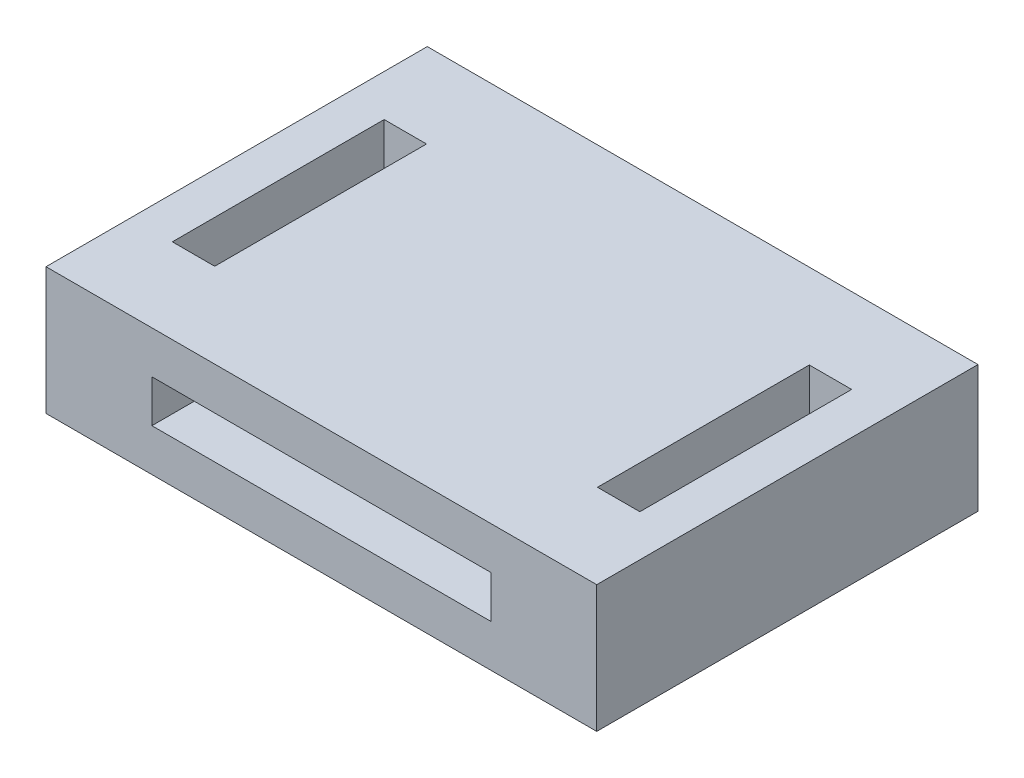
ISO-10303-21;
HEADER;
FILE_DESCRIPTION(('STEP AP214'),'2;1');
FILE_NAME('part.step','',(''),(''),'','','');
FILE_SCHEMA(('AUTOMOTIVE_DESIGN { 1 0 10303 214 1 1 1 1 }'));
ENDSEC;
DATA;
#1=APPLICATION_CONTEXT('core data for automotive mechanical design processes');
#2=APPLICATION_PROTOCOL_DEFINITION('international standard','automotive_design',2000,#1);
#3=PRODUCT_CONTEXT('',#1,'mechanical');
#4=PRODUCT('Part','Part','',(#3));
#5=PRODUCT_RELATED_PRODUCT_CATEGORY('part','',(#4));
#6=PRODUCT_DEFINITION_FORMATION('','',#4);
#7=PRODUCT_DEFINITION_CONTEXT('part definition',#1,'design');
#8=PRODUCT_DEFINITION('design','',#6,#7);
#9=PRODUCT_DEFINITION_SHAPE('','',#8);
#10=(LENGTH_UNIT() NAMED_UNIT(*) SI_UNIT(.MILLI.,.METRE.));
#11=(NAMED_UNIT(*) PLANE_ANGLE_UNIT() SI_UNIT($,.RADIAN.));
#12=(NAMED_UNIT(*) SI_UNIT($,.STERADIAN.) SOLID_ANGLE_UNIT());
#13=UNCERTAINTY_MEASURE_WITH_UNIT(LENGTH_MEASURE(1.E-05),#10,'distance_accuracy_value','');
#14=(GEOMETRIC_REPRESENTATION_CONTEXT(3) GLOBAL_UNCERTAINTY_ASSIGNED_CONTEXT((#13)) GLOBAL_UNIT_ASSIGNED_CONTEXT((#10,
#11,#12)) REPRESENTATION_CONTEXT('',''));
#15=CARTESIAN_POINT('',(0.,0.,0.));
#16=DIRECTION('',(0.,0.,1.));
#17=DIRECTION('',(1.,0.,0.));
#18=AXIS2_PLACEMENT_3D('',#15,#16,#17);
#19=CARTESIAN_POINT('',(0.,2.54,0.));
#20=DIRECTION('',(0.,-1.,0.));
#21=DIRECTION('',(0.,0.,-1.));
#22=AXIS2_PLACEMENT_3D('',#19,#20,#21);
#23=PLANE('',#22);
#24=CARTESIAN_POINT('',(-5.31894104825574,2.54,-1.27));
#25=DIRECTION('',(0.,-1.,0.));
#26=DIRECTION('',(0.,0.,-1.));
#27=AXIS2_PLACEMENT_3D('',#24,#25,#26);
#28=CIRCLE('',#27,1.016);
#29=CARTESIAN_POINT('',(-5.31894104825574,2.54,-2.286));
#30=VERTEX_POINT('',#29);
#31=EDGE_CURVE('E43',#30,#30,#28,.F.);
#32=ORIENTED_EDGE('',*,*,#31,.F.);
#33=EDGE_LOOP('',(#32));
#34=FACE_BOUND('',#33,.T.);
#35=CARTESIAN_POINT('',(5.31894104825574,2.54,-1.27));
#36=DIRECTION('',(0.,-1.,0.));
#37=DIRECTION('',(0.,0.,-1.));
#38=AXIS2_PLACEMENT_3D('',#35,#36,#37);
#39=CIRCLE('',#38,1.016);
#40=CARTESIAN_POINT('',(5.31894104825574,2.54,-2.286));
#41=VERTEX_POINT('',#40);
#42=EDGE_CURVE('E11',#41,#41,#39,.F.);
#43=ORIENTED_EDGE('',*,*,#42,.F.);
#44=EDGE_LOOP('',(#43));
#45=FACE_BOUND('',#44,.T.);
#46=DIRECTION('',(0.,0.,1.));
#47=VECTOR('',#46,1.);
#48=CARTESIAN_POINT('',(10.16,2.54,-6.35));
#49=LINE('',#48,#47);
#50=CARTESIAN_POINT('',(10.16,2.54,-6.35));
#51=VERTEX_POINT('',#50);
#52=CARTESIAN_POINT('',(10.16,2.54,11.43));
#53=VERTEX_POINT('',#52);
#54=EDGE_CURVE('E50',#51,#53,#49,.T.);
#55=ORIENTED_EDGE('',*,*,#54,.F.);
#56=DIRECTION('',(1.,0.,0.));
#57=VECTOR('',#56,1.);
#58=CARTESIAN_POINT('',(-10.16,2.54,-6.35));
#59=LINE('',#58,#57);
#60=CARTESIAN_POINT('',(-10.16,2.54,-6.35));
#61=VERTEX_POINT('',#60);
#62=EDGE_CURVE('E55',#61,#51,#59,.T.);
#63=ORIENTED_EDGE('',*,*,#62,.F.);
#64=DIRECTION('',(0.,0.,-1.));
#65=VECTOR('',#64,1.);
#66=CARTESIAN_POINT('',(-10.16,2.54,11.43));
#67=LINE('',#66,#65);
#68=CARTESIAN_POINT('',(-10.16,2.54,11.43));
#69=VERTEX_POINT('',#68);
#70=EDGE_CURVE('E368',#69,#61,#67,.T.);
#71=ORIENTED_EDGE('',*,*,#70,.F.);
#72=DIRECTION('',(1.,0.,0.));
#73=VECTOR('',#72,1.);
#74=CARTESIAN_POINT('',(-16.51,2.54,11.43));
#75=LINE('',#74,#73);
#76=EDGE_CURVE('E233',#69,#53,#75,.T.);
#77=ORIENTED_EDGE('',*,*,#76,.T.);
#78=EDGE_LOOP('',(#55,#63,#71,#77));
#79=FACE_BOUND('',#78,.T.);
#80=ADVANCED_FACE('F35',(#34,#45,#79),#23,.F.);
#81=CARTESIAN_POINT('',(0.,5.08,0.));
#82=DIRECTION('',(0.,1.,0.));
#83=DIRECTION('',(0.,0.,1.));
#84=AXIS2_PLACEMENT_3D('',#81,#82,#83);
#85=PLANE('',#84);
#86=CARTESIAN_POINT('',(5.31894104825574,5.08,-1.27));
#87=DIRECTION('',(0.,1.,0.));
#88=DIRECTION('',(0.,0.,-1.));
#89=AXIS2_PLACEMENT_3D('',#86,#87,#88);
#90=CIRCLE('',#89,1.016);
#91=CARTESIAN_POINT('',(5.31894104825574,5.08,-2.286));
#92=VERTEX_POINT('',#91);
#93=EDGE_CURVE('E182',#92,#92,#90,.T.);
#94=ORIENTED_EDGE('',*,*,#93,.T.);
#95=EDGE_LOOP('',(#94));
#96=FACE_BOUND('',#95,.T.);
#97=CARTESIAN_POINT('',(-5.31894104825574,5.08,-1.27));
#98=DIRECTION('',(0.,1.,0.));
#99=DIRECTION('',(0.,0.,1.));
#100=AXIS2_PLACEMENT_3D('',#97,#98,#99);
#101=CIRCLE('',#100,1.016);
#102=CARTESIAN_POINT('',(-5.31894104825574,5.08,-0.254000000000001));
#103=VERTEX_POINT('',#102);
#104=EDGE_CURVE('E185',#103,#103,#101,.T.);
#105=ORIENTED_EDGE('',*,*,#104,.T.);
#106=EDGE_LOOP('',(#105));
#107=FACE_BOUND('',#106,.T.);
#108=DIRECTION('',(0.,0.,1.));
#109=VECTOR('',#108,1.);
#110=CARTESIAN_POINT('',(10.16,5.08,-6.35));
#111=LINE('',#110,#109);
#112=CARTESIAN_POINT('',(10.16,5.08,-6.35));
#113=VERTEX_POINT('',#112);
#114=CARTESIAN_POINT('',(10.16,5.08,11.43));
#115=VERTEX_POINT('',#114);
#116=EDGE_CURVE('E149',#113,#115,#111,.T.);
#117=ORIENTED_EDGE('',*,*,#116,.T.);
#118=DIRECTION('',(1.,0.,0.));
#119=VECTOR('',#118,1.);
#120=CARTESIAN_POINT('',(-16.51,5.08,11.43));
#121=LINE('',#120,#119);
#122=CARTESIAN_POINT('',(-10.16,5.08,11.43));
#123=VERTEX_POINT('',#122);
#124=EDGE_CURVE('E161',#123,#115,#121,.T.);
#125=ORIENTED_EDGE('',*,*,#124,.F.);
#126=DIRECTION('',(0.,0.,-1.));
#127=VECTOR('',#126,1.);
#128=CARTESIAN_POINT('',(-10.16,5.08,11.43));
#129=LINE('',#128,#127);
#130=CARTESIAN_POINT('',(-10.16,5.08,-6.35));
#131=VERTEX_POINT('',#130);
#132=EDGE_CURVE('E371',#123,#131,#129,.T.);
#133=ORIENTED_EDGE('',*,*,#132,.T.);
#134=DIRECTION('',(1.,0.,0.));
#135=VECTOR('',#134,1.);
#136=CARTESIAN_POINT('',(-10.16,5.08,-6.35));
#137=LINE('',#136,#135);
#138=EDGE_CURVE('E162',#131,#113,#137,.T.);
#139=ORIENTED_EDGE('',*,*,#138,.T.);
#140=EDGE_LOOP('',(#117,#125,#133,#139));
#141=FACE_BOUND('',#140,.T.);
#142=ADVANCED_FACE('F159',(#96,#107,#141),#85,.F.);
#143=CARTESIAN_POINT('',(0.,0.,0.));
#144=DIRECTION('',(0.,-1.,0.));
#145=DIRECTION('',(0.,0.,-1.));
#146=AXIS2_PLACEMENT_3D('',#143,#144,#145);
#147=PLANE('',#146);
#148=DIRECTION('',(0.,0.,-1.));
#149=VECTOR('',#148,1.);
#150=CARTESIAN_POINT('',(16.51,0.,11.43));
#151=LINE('',#150,#149);
#152=CARTESIAN_POINT('',(16.51,0.,11.43));
#153=VERTEX_POINT('',#152);
#154=CARTESIAN_POINT('',(16.51,0.,-11.43));
#155=VERTEX_POINT('',#154);
#156=EDGE_CURVE('E232',#153,#155,#151,.T.);
#157=ORIENTED_EDGE('',*,*,#156,.F.);
#158=DIRECTION('',(1.,0.,0.));
#159=VECTOR('',#158,1.);
#160=CARTESIAN_POINT('',(-16.51,0.,11.43));
#161=LINE('',#160,#159);
#162=CARTESIAN_POINT('',(-16.51,0.,11.43));
#163=VERTEX_POINT('',#162);
#164=EDGE_CURVE('E236',#163,#153,#161,.T.);
#165=ORIENTED_EDGE('',*,*,#164,.F.);
#166=DIRECTION('',(0.,0.,1.));
#167=VECTOR('',#166,1.);
#168=CARTESIAN_POINT('',(-16.51,0.,11.43));
#169=LINE('',#168,#167);
#170=CARTESIAN_POINT('',(-16.51,0.,-11.43));
#171=VERTEX_POINT('',#170);
#172=EDGE_CURVE('E241',#171,#163,#169,.T.);
#173=ORIENTED_EDGE('',*,*,#172,.F.);
#174=DIRECTION('',(-1.,0.,0.));
#175=VECTOR('',#174,1.);
#176=CARTESIAN_POINT('',(-16.51,0.,-11.43));
#177=LINE('',#176,#175);
#178=EDGE_CURVE('E239',#155,#171,#177,.T.);
#179=ORIENTED_EDGE('',*,*,#178,.F.);
#180=EDGE_LOOP('',(#157,#165,#173,#179));
#181=FACE_BOUND('',#180,.T.);
#182=DIRECTION('',(-1.,0.,0.));
#183=VECTOR('',#182,1.);
#184=CARTESIAN_POINT('',(-11.474898989899,0.,-6.35));
#185=LINE('',#184,#183);
#186=CARTESIAN_POINT('',(-11.474898989899,0.,-6.35));
#187=VERTEX_POINT('',#186);
#188=CARTESIAN_POINT('',(-14.014898989899,0.,-6.35));
#189=VERTEX_POINT('',#188);
#190=EDGE_CURVE('E219',#187,#189,#185,.T.);
#191=ORIENTED_EDGE('',*,*,#190,.T.);
#192=DIRECTION('',(0.,0.,1.));
#193=VECTOR('',#192,1.);
#194=CARTESIAN_POINT('',(-14.014898989899,0.,6.35));
#195=LINE('',#194,#193);
#196=CARTESIAN_POINT('',(-14.014898989899,0.,6.35));
#197=VERTEX_POINT('',#196);
#198=EDGE_CURVE('E210',#189,#197,#195,.T.);
#199=ORIENTED_EDGE('',*,*,#198,.T.);
#200=DIRECTION('',(1.,0.,0.));
#201=VECTOR('',#200,1.);
#202=CARTESIAN_POINT('',(-11.474898989899,0.,6.35));
#203=LINE('',#202,#201);
#204=CARTESIAN_POINT('',(-11.474898989899,0.,6.35));
#205=VERTEX_POINT('',#204);
#206=EDGE_CURVE('E213',#197,#205,#203,.T.);
#207=ORIENTED_EDGE('',*,*,#206,.T.);
#208=DIRECTION('',(0.,0.,-1.));
#209=VECTOR('',#208,1.);
#210=CARTESIAN_POINT('',(-11.474898989899,0.,6.35));
#211=LINE('',#210,#209);
#212=EDGE_CURVE('E216',#205,#187,#211,.T.);
#213=ORIENTED_EDGE('',*,*,#212,.T.);
#214=EDGE_LOOP('',(#191,#199,#207,#213));
#215=FACE_BOUND('',#214,.T.);
#216=DIRECTION('',(-1.,0.,0.));
#217=VECTOR('',#216,1.);
#218=CARTESIAN_POINT('',(11.474898989899,0.,-6.35));
#219=LINE('',#218,#217);
#220=CARTESIAN_POINT('',(14.014898989899,0.,-6.35));
#221=VERTEX_POINT('',#220);
#222=CARTESIAN_POINT('',(11.474898989899,0.,-6.35));
#223=VERTEX_POINT('',#222);
#224=EDGE_CURVE('E197',#221,#223,#219,.T.);
#225=ORIENTED_EDGE('',*,*,#224,.T.);
#226=DIRECTION('',(0.,0.,1.));
#227=VECTOR('',#226,1.);
#228=CARTESIAN_POINT('',(11.474898989899,0.,6.35));
#229=LINE('',#228,#227);
#230=CARTESIAN_POINT('',(11.474898989899,0.,6.35));
#231=VERTEX_POINT('',#230);
#232=EDGE_CURVE('E188',#223,#231,#229,.T.);
#233=ORIENTED_EDGE('',*,*,#232,.T.);
#234=DIRECTION('',(1.,0.,0.));
#235=VECTOR('',#234,1.);
#236=CARTESIAN_POINT('',(11.474898989899,0.,6.35));
#237=LINE('',#236,#235);
#238=CARTESIAN_POINT('',(14.014898989899,0.,6.35));
#239=VERTEX_POINT('',#238);
#240=EDGE_CURVE('E191',#231,#239,#237,.T.);
#241=ORIENTED_EDGE('',*,*,#240,.T.);
#242=DIRECTION('',(0.,0.,-1.));
#243=VECTOR('',#242,1.);
#244=CARTESIAN_POINT('',(14.014898989899,0.,6.35));
#245=LINE('',#244,#243);
#246=EDGE_CURVE('E194',#239,#221,#245,.T.);
#247=ORIENTED_EDGE('',*,*,#246,.T.);
#248=EDGE_LOOP('',(#225,#233,#241,#247));
#249=FACE_BOUND('',#248,.T.);
#250=ADVANCED_FACE('F312',(#181,#215,#249),#147,.T.);
#251=CARTESIAN_POINT('',(16.51,2.54,11.43));
#252=DIRECTION('',(-1.,0.,0.));
#253=DIRECTION('',(0.,0.,1.));
#254=AXIS2_PLACEMENT_3D('',#251,#252,#253);
#255=PLANE('',#254);
#256=ORIENTED_EDGE('',*,*,#156,.T.);
#257=DIRECTION('',(0.,-1.,0.));
#258=VECTOR('',#257,1.);
#259=CARTESIAN_POINT('',(16.51,2.54,-11.43));
#260=LINE('',#259,#258);
#261=CARTESIAN_POINT('',(16.51,7.62,-11.43));
#262=VERTEX_POINT('',#261);
#263=EDGE_CURVE('E252',#262,#155,#260,.T.);
#264=ORIENTED_EDGE('',*,*,#263,.F.);
#265=DIRECTION('',(0.,0.,-1.));
#266=VECTOR('',#265,1.);
#267=CARTESIAN_POINT('',(16.51,7.62,-11.43));
#268=LINE('',#267,#266);
#269=CARTESIAN_POINT('',(16.51,7.62,11.43));
#270=VERTEX_POINT('',#269);
#271=EDGE_CURVE('E339',#270,#262,#268,.T.);
#272=ORIENTED_EDGE('',*,*,#271,.F.);
#273=DIRECTION('',(0.,-1.,0.));
#274=VECTOR('',#273,1.);
#275=CARTESIAN_POINT('',(16.51,2.54,11.43));
#276=LINE('',#275,#274);
#277=EDGE_CURVE('E235',#270,#153,#276,.T.);
#278=ORIENTED_EDGE('',*,*,#277,.T.);
#279=EDGE_LOOP('',(#256,#264,#272,#278));
#280=FACE_BOUND('',#279,.T.);
#281=ADVANCED_FACE('F37',(#280),#255,.F.);
#282=CARTESIAN_POINT('',(-16.51,2.54,-11.43));
#283=DIRECTION('',(0.,0.,1.));
#284=DIRECTION('',(1.,0.,0.));
#285=AXIS2_PLACEMENT_3D('',#282,#283,#284);
#286=PLANE('',#285);
#287=ORIENTED_EDGE('',*,*,#178,.T.);
#288=DIRECTION('',(0.,-1.,0.));
#289=VECTOR('',#288,1.);
#290=CARTESIAN_POINT('',(-16.51,2.54,-11.43));
#291=LINE('',#290,#289);
#292=CARTESIAN_POINT('',(-16.51,7.62,-11.43));
#293=VERTEX_POINT('',#292);
#294=EDGE_CURVE('E249',#293,#171,#291,.T.);
#295=ORIENTED_EDGE('',*,*,#294,.F.);
#296=DIRECTION('',(-1.,0.,0.));
#297=VECTOR('',#296,1.);
#298=CARTESIAN_POINT('',(-16.51,7.62,-11.43));
#299=LINE('',#298,#297);
#300=EDGE_CURVE('E180',#262,#293,#299,.T.);
#301=ORIENTED_EDGE('',*,*,#300,.F.);
#302=ORIENTED_EDGE('',*,*,#263,.T.);
#303=EDGE_LOOP('',(#287,#295,#301,#302));
#304=FACE_BOUND('',#303,.T.);
#305=ADVANCED_FACE('F320',(#304),#286,.F.);
#306=CARTESIAN_POINT('',(-16.51,2.54,11.43));
#307=DIRECTION('',(1.,0.,0.));
#308=DIRECTION('',(0.,0.,-1.));
#309=AXIS2_PLACEMENT_3D('',#306,#307,#308);
#310=PLANE('',#309);
#311=ORIENTED_EDGE('',*,*,#172,.T.);
#312=DIRECTION('',(0.,-1.,0.));
#313=VECTOR('',#312,1.);
#314=CARTESIAN_POINT('',(-16.51,2.54,11.43));
#315=LINE('',#314,#313);
#316=CARTESIAN_POINT('',(-16.51,7.62,11.43));
#317=VERTEX_POINT('',#316);
#318=EDGE_CURVE('E246',#317,#163,#315,.T.);
#319=ORIENTED_EDGE('',*,*,#318,.F.);
#320=DIRECTION('',(0.,0.,1.));
#321=VECTOR('',#320,1.);
#322=CARTESIAN_POINT('',(-16.51,7.62,-11.43));
#323=LINE('',#322,#321);
#324=EDGE_CURVE('E169',#293,#317,#323,.T.);
#325=ORIENTED_EDGE('',*,*,#324,.F.);
#326=ORIENTED_EDGE('',*,*,#294,.T.);
#327=EDGE_LOOP('',(#311,#319,#325,#326));
#328=FACE_BOUND('',#327,.T.);
#329=ADVANCED_FACE('F318',(#328),#310,.F.);
#330=CARTESIAN_POINT('',(-16.51,2.54,11.43));
#331=DIRECTION('',(0.,0.,-1.));
#332=DIRECTION('',(-1.,0.,0.));
#333=AXIS2_PLACEMENT_3D('',#330,#331,#332);
#334=PLANE('',#333);
#335=ORIENTED_EDGE('',*,*,#76,.F.);
#336=DIRECTION('',(0.,-1.,0.));
#337=VECTOR('',#336,1.);
#338=CARTESIAN_POINT('',(-10.16,45.2409262841384,11.43));
#339=LINE('',#338,#337);
#340=EDGE_CURVE('E168',#123,#69,#339,.T.);
#341=ORIENTED_EDGE('',*,*,#340,.F.);
#342=ORIENTED_EDGE('',*,*,#124,.T.);
#343=DIRECTION('',(0.,-1.,0.));
#344=VECTOR('',#343,1.);
#345=CARTESIAN_POINT('',(10.16,45.2409262841384,11.43));
#346=LINE('',#345,#344);
#347=EDGE_CURVE('E146',#115,#53,#346,.T.);
#348=ORIENTED_EDGE('',*,*,#347,.T.);
#349=EDGE_LOOP('',(#335,#341,#342,#348));
#350=FACE_BOUND('',#349,.T.);
#351=ORIENTED_EDGE('',*,*,#164,.T.);
#352=ORIENTED_EDGE('',*,*,#277,.F.);
#353=DIRECTION('',(1.,0.,0.));
#354=VECTOR('',#353,1.);
#355=CARTESIAN_POINT('',(-16.51,7.62,11.43));
#356=LINE('',#355,#354);
#357=EDGE_CURVE('E173',#317,#270,#356,.T.);
#358=ORIENTED_EDGE('',*,*,#357,.F.);
#359=ORIENTED_EDGE('',*,*,#318,.T.);
#360=EDGE_LOOP('',(#351,#352,#358,#359));
#361=FACE_BOUND('',#360,.T.);
#362=ADVANCED_FACE('F165',(#350,#361),#334,.F.);
#363=CARTESIAN_POINT('',(-14.014898989899,2.54,6.35));
#364=DIRECTION('',(1.,0.,0.));
#365=DIRECTION('',(0.,0.,-1.));
#366=AXIS2_PLACEMENT_3D('',#363,#364,#365);
#367=PLANE('',#366);
#368=ORIENTED_EDGE('',*,*,#198,.F.);
#369=DIRECTION('',(0.,-1.,0.));
#370=VECTOR('',#369,1.);
#371=CARTESIAN_POINT('',(-14.014898989899,2.54,-6.35));
#372=LINE('',#371,#370);
#373=CARTESIAN_POINT('',(-14.014898989899,7.62,-6.35));
#374=VERTEX_POINT('',#373);
#375=EDGE_CURVE('E222',#374,#189,#372,.T.);
#376=ORIENTED_EDGE('',*,*,#375,.F.);
#377=DIRECTION('',(0.,0.,1.));
#378=VECTOR('',#377,1.);
#379=CARTESIAN_POINT('',(-14.014898989899,7.62,-6.35));
#380=LINE('',#379,#378);
#381=CARTESIAN_POINT('',(-14.014898989899,7.62,6.35));
#382=VERTEX_POINT('',#381);
#383=EDGE_CURVE('E347',#374,#382,#380,.T.);
#384=ORIENTED_EDGE('',*,*,#383,.T.);
#385=DIRECTION('',(0.,-1.,0.));
#386=VECTOR('',#385,1.);
#387=CARTESIAN_POINT('',(-14.014898989899,2.54,6.35));
#388=LINE('',#387,#386);
#389=EDGE_CURVE('E229',#382,#197,#388,.T.);
#390=ORIENTED_EDGE('',*,*,#389,.T.);
#391=EDGE_LOOP('',(#368,#376,#384,#390));
#392=FACE_BOUND('',#391,.T.);
#393=ADVANCED_FACE('F307',(#392),#367,.T.);
#394=CARTESIAN_POINT('',(-11.474898989899,2.54,6.35));
#395=DIRECTION('',(0.,0.,-1.));
#396=DIRECTION('',(-1.,0.,0.));
#397=AXIS2_PLACEMENT_3D('',#394,#395,#396);
#398=PLANE('',#397);
#399=ORIENTED_EDGE('',*,*,#206,.F.);
#400=ORIENTED_EDGE('',*,*,#389,.F.);
#401=DIRECTION('',(1.,0.,0.));
#402=VECTOR('',#401,1.);
#403=CARTESIAN_POINT('',(-14.014898989899,7.62,6.35));
#404=LINE('',#403,#402);
#405=CARTESIAN_POINT('',(-11.474898989899,7.62,6.35));
#406=VERTEX_POINT('',#405);
#407=EDGE_CURVE('E344',#382,#406,#404,.T.);
#408=ORIENTED_EDGE('',*,*,#407,.T.);
#409=DIRECTION('',(0.,-1.,0.));
#410=VECTOR('',#409,1.);
#411=CARTESIAN_POINT('',(-11.474898989899,2.54,6.35));
#412=LINE('',#411,#410);
#413=EDGE_CURVE('E227',#406,#205,#412,.T.);
#414=ORIENTED_EDGE('',*,*,#413,.T.);
#415=EDGE_LOOP('',(#399,#400,#408,#414));
#416=FACE_BOUND('',#415,.T.);
#417=ADVANCED_FACE('F303',(#416),#398,.T.);
#418=CARTESIAN_POINT('',(-11.474898989899,2.54,6.35));
#419=DIRECTION('',(-1.,0.,0.));
#420=DIRECTION('',(0.,0.,1.));
#421=AXIS2_PLACEMENT_3D('',#418,#419,#420);
#422=PLANE('',#421);
#423=ORIENTED_EDGE('',*,*,#212,.F.);
#424=ORIENTED_EDGE('',*,*,#413,.F.);
#425=DIRECTION('',(0.,0.,-1.));
#426=VECTOR('',#425,1.);
#427=CARTESIAN_POINT('',(-11.474898989899,7.62,-6.35));
#428=LINE('',#427,#426);
#429=CARTESIAN_POINT('',(-11.474898989899,7.62,-6.35));
#430=VERTEX_POINT('',#429);
#431=EDGE_CURVE('E176',#406,#430,#428,.T.);
#432=ORIENTED_EDGE('',*,*,#431,.T.);
#433=DIRECTION('',(0.,-1.,0.));
#434=VECTOR('',#433,1.);
#435=CARTESIAN_POINT('',(-11.474898989899,2.54,-6.35));
#436=LINE('',#435,#434);
#437=EDGE_CURVE('E225',#430,#187,#436,.T.);
#438=ORIENTED_EDGE('',*,*,#437,.T.);
#439=EDGE_LOOP('',(#423,#424,#432,#438));
#440=FACE_BOUND('',#439,.T.);
#441=ADVANCED_FACE('F299',(#440),#422,.T.);
#442=CARTESIAN_POINT('',(-11.474898989899,2.54,-6.35));
#443=DIRECTION('',(0.,0.,1.));
#444=DIRECTION('',(1.,0.,0.));
#445=AXIS2_PLACEMENT_3D('',#442,#443,#444);
#446=PLANE('',#445);
#447=ORIENTED_EDGE('',*,*,#190,.F.);
#448=ORIENTED_EDGE('',*,*,#437,.F.);
#449=DIRECTION('',(-1.,0.,0.));
#450=VECTOR('',#449,1.);
#451=CARTESIAN_POINT('',(-14.014898989899,7.62,-6.35));
#452=LINE('',#451,#450);
#453=EDGE_CURVE('E170',#430,#374,#452,.T.);
#454=ORIENTED_EDGE('',*,*,#453,.T.);
#455=ORIENTED_EDGE('',*,*,#375,.T.);
#456=EDGE_LOOP('',(#447,#448,#454,#455));
#457=FACE_BOUND('',#456,.T.);
#458=ADVANCED_FACE('F295',(#457),#446,.T.);
#459=CARTESIAN_POINT('',(11.474898989899,2.54,6.35));
#460=DIRECTION('',(1.,0.,0.));
#461=DIRECTION('',(0.,0.,-1.));
#462=AXIS2_PLACEMENT_3D('',#459,#460,#461);
#463=PLANE('',#462);
#464=ORIENTED_EDGE('',*,*,#232,.F.);
#465=DIRECTION('',(0.,-1.,0.));
#466=VECTOR('',#465,1.);
#467=CARTESIAN_POINT('',(11.474898989899,2.54,-6.35));
#468=LINE('',#467,#466);
#469=CARTESIAN_POINT('',(11.474898989899,7.62,-6.35));
#470=VERTEX_POINT('',#469);
#471=EDGE_CURVE('E200',#470,#223,#468,.T.);
#472=ORIENTED_EDGE('',*,*,#471,.F.);
#473=DIRECTION('',(0.,0.,1.));
#474=VECTOR('',#473,1.);
#475=CARTESIAN_POINT('',(11.474898989899,7.62,-6.35));
#476=LINE('',#475,#474);
#477=CARTESIAN_POINT('',(11.474898989899,7.62,6.35));
#478=VERTEX_POINT('',#477);
#479=EDGE_CURVE('E359',#470,#478,#476,.T.);
#480=ORIENTED_EDGE('',*,*,#479,.T.);
#481=DIRECTION('',(0.,-1.,0.));
#482=VECTOR('',#481,1.);
#483=CARTESIAN_POINT('',(11.474898989899,2.54,6.35));
#484=LINE('',#483,#482);
#485=EDGE_CURVE('E207',#478,#231,#484,.T.);
#486=ORIENTED_EDGE('',*,*,#485,.T.);
#487=EDGE_LOOP('',(#464,#472,#480,#486));
#488=FACE_BOUND('',#487,.T.);
#489=ADVANCED_FACE('F291',(#488),#463,.T.);
#490=CARTESIAN_POINT('',(11.474898989899,2.54,6.35));
#491=DIRECTION('',(0.,0.,-1.));
#492=DIRECTION('',(-1.,0.,0.));
#493=AXIS2_PLACEMENT_3D('',#490,#491,#492);
#494=PLANE('',#493);
#495=ORIENTED_EDGE('',*,*,#240,.F.);
#496=ORIENTED_EDGE('',*,*,#485,.F.);
#497=DIRECTION('',(1.,0.,0.));
#498=VECTOR('',#497,1.);
#499=CARTESIAN_POINT('',(11.474898989899,7.62,6.35));
#500=LINE('',#499,#498);
#501=CARTESIAN_POINT('',(14.014898989899,7.62,6.35));
#502=VERTEX_POINT('',#501);
#503=EDGE_CURVE('E356',#478,#502,#500,.T.);
#504=ORIENTED_EDGE('',*,*,#503,.T.);
#505=DIRECTION('',(0.,-1.,0.));
#506=VECTOR('',#505,1.);
#507=CARTESIAN_POINT('',(14.014898989899,2.54,6.35));
#508=LINE('',#507,#506);
#509=EDGE_CURVE('E205',#502,#239,#508,.T.);
#510=ORIENTED_EDGE('',*,*,#509,.T.);
#511=EDGE_LOOP('',(#495,#496,#504,#510));
#512=FACE_BOUND('',#511,.T.);
#513=ADVANCED_FACE('F287',(#512),#494,.T.);
#514=CARTESIAN_POINT('',(14.014898989899,2.54,6.35));
#515=DIRECTION('',(-1.,0.,0.));
#516=DIRECTION('',(0.,0.,1.));
#517=AXIS2_PLACEMENT_3D('',#514,#515,#516);
#518=PLANE('',#517);
#519=ORIENTED_EDGE('',*,*,#246,.F.);
#520=ORIENTED_EDGE('',*,*,#509,.F.);
#521=DIRECTION('',(0.,0.,-1.));
#522=VECTOR('',#521,1.);
#523=CARTESIAN_POINT('',(14.014898989899,7.62,-6.35));
#524=LINE('',#523,#522);
#525=CARTESIAN_POINT('',(14.014898989899,7.62,-6.35));
#526=VERTEX_POINT('',#525);
#527=EDGE_CURVE('E353',#502,#526,#524,.T.);
#528=ORIENTED_EDGE('',*,*,#527,.T.);
#529=DIRECTION('',(0.,-1.,0.));
#530=VECTOR('',#529,1.);
#531=CARTESIAN_POINT('',(14.014898989899,2.54,-6.35));
#532=LINE('',#531,#530);
#533=EDGE_CURVE('E203',#526,#221,#532,.T.);
#534=ORIENTED_EDGE('',*,*,#533,.T.);
#535=EDGE_LOOP('',(#519,#520,#528,#534));
#536=FACE_BOUND('',#535,.T.);
#537=ADVANCED_FACE('F283',(#536),#518,.T.);
#538=CARTESIAN_POINT('',(11.474898989899,2.54,-6.35));
#539=DIRECTION('',(0.,0.,1.));
#540=DIRECTION('',(1.,0.,0.));
#541=AXIS2_PLACEMENT_3D('',#538,#539,#540);
#542=PLANE('',#541);
#543=ORIENTED_EDGE('',*,*,#224,.F.);
#544=ORIENTED_EDGE('',*,*,#533,.F.);
#545=DIRECTION('',(-1.,0.,0.));
#546=VECTOR('',#545,1.);
#547=CARTESIAN_POINT('',(11.474898989899,7.62,-6.35));
#548=LINE('',#547,#546);
#549=EDGE_CURVE('E350',#526,#470,#548,.T.);
#550=ORIENTED_EDGE('',*,*,#549,.T.);
#551=ORIENTED_EDGE('',*,*,#471,.T.);
#552=EDGE_LOOP('',(#543,#544,#550,#551));
#553=FACE_BOUND('',#552,.T.);
#554=ADVANCED_FACE('F275',(#553),#542,.T.);
#555=CARTESIAN_POINT('',(-5.31894104825574,5.08,-1.27));
#556=DIRECTION('',(0.,-1.,0.));
#557=DIRECTION('',(0.,0.,-1.));
#558=AXIS2_PLACEMENT_3D('',#555,#556,#557);
#559=CYLINDRICAL_SURFACE('',#558,1.016);
#560=ORIENTED_EDGE('',*,*,#104,.F.);
#561=EDGE_LOOP('',(#560));
#562=FACE_BOUND('',#561,.T.);
#563=ORIENTED_EDGE('',*,*,#31,.T.);
#564=EDGE_LOOP('',(#563));
#565=FACE_BOUND('',#564,.T.);
#566=ADVANCED_FACE('F257',(#562,#565),#559,.T.);
#567=CARTESIAN_POINT('',(5.31894104825574,5.08,-1.27));
#568=DIRECTION('',(0.,-1.,0.));
#569=DIRECTION('',(0.,0.,-1.));
#570=AXIS2_PLACEMENT_3D('',#567,#568,#569);
#571=CYLINDRICAL_SURFACE('',#570,1.016);
#572=ORIENTED_EDGE('',*,*,#93,.F.);
#573=EDGE_LOOP('',(#572));
#574=FACE_BOUND('',#573,.T.);
#575=ORIENTED_EDGE('',*,*,#42,.T.);
#576=EDGE_LOOP('',(#575));
#577=FACE_BOUND('',#576,.T.);
#578=ADVANCED_FACE('F264',(#574,#577),#571,.T.);
#579=CARTESIAN_POINT('',(0.,7.62,0.));
#580=DIRECTION('',(0.,1.,0.));
#581=DIRECTION('',(0.,0.,1.));
#582=AXIS2_PLACEMENT_3D('',#579,#580,#581);
#583=PLANE('',#582);
#584=ORIENTED_EDGE('',*,*,#324,.T.);
#585=ORIENTED_EDGE('',*,*,#357,.T.);
#586=ORIENTED_EDGE('',*,*,#271,.T.);
#587=ORIENTED_EDGE('',*,*,#300,.T.);
#588=EDGE_LOOP('',(#584,#585,#586,#587));
#589=FACE_BOUND('',#588,.T.);
#590=ORIENTED_EDGE('',*,*,#407,.F.);
#591=ORIENTED_EDGE('',*,*,#383,.F.);
#592=ORIENTED_EDGE('',*,*,#453,.F.);
#593=ORIENTED_EDGE('',*,*,#431,.F.);
#594=EDGE_LOOP('',(#590,#591,#592,#593));
#595=FACE_BOUND('',#594,.T.);
#596=ORIENTED_EDGE('',*,*,#503,.F.);
#597=ORIENTED_EDGE('',*,*,#479,.F.);
#598=ORIENTED_EDGE('',*,*,#549,.F.);
#599=ORIENTED_EDGE('',*,*,#527,.F.);
#600=EDGE_LOOP('',(#596,#597,#598,#599));
#601=FACE_BOUND('',#600,.T.);
#602=ADVANCED_FACE('F266',(#589,#595,#601),#583,.T.);
#603=CARTESIAN_POINT('',(10.16,45.2409262841384,-6.35));
#604=DIRECTION('',(1.,0.,0.));
#605=DIRECTION('',(0.,0.,-1.));
#606=AXIS2_PLACEMENT_3D('',#603,#604,#605);
#607=PLANE('',#606);
#608=ORIENTED_EDGE('',*,*,#116,.F.);
#609=DIRECTION('',(0.,-1.,0.));
#610=VECTOR('',#609,1.);
#611=CARTESIAN_POINT('',(10.16,45.2409262841384,-6.35));
#612=LINE('',#611,#610);
#613=EDGE_CURVE('E154',#113,#51,#612,.T.);
#614=ORIENTED_EDGE('',*,*,#613,.T.);
#615=ORIENTED_EDGE('',*,*,#54,.T.);
#616=ORIENTED_EDGE('',*,*,#347,.F.);
#617=EDGE_LOOP('',(#608,#614,#615,#616));
#618=FACE_BOUND('',#617,.T.);
#619=ADVANCED_FACE('F148',(#618),#607,.F.);
#620=CARTESIAN_POINT('',(-10.16,45.2409262841384,-6.35));
#621=DIRECTION('',(0.,0.,-1.));
#622=DIRECTION('',(-1.,0.,0.));
#623=AXIS2_PLACEMENT_3D('',#620,#621,#622);
#624=PLANE('',#623);
#625=ORIENTED_EDGE('',*,*,#138,.F.);
#626=DIRECTION('',(0.,-1.,0.));
#627=VECTOR('',#626,1.);
#628=CARTESIAN_POINT('',(-10.16,45.2409262841384,-6.35));
#629=LINE('',#628,#627);
#630=EDGE_CURVE('E363',#131,#61,#629,.T.);
#631=ORIENTED_EDGE('',*,*,#630,.T.);
#632=ORIENTED_EDGE('',*,*,#62,.T.);
#633=ORIENTED_EDGE('',*,*,#613,.F.);
#634=EDGE_LOOP('',(#625,#631,#632,#633));
#635=FACE_BOUND('',#634,.T.);
#636=ADVANCED_FACE('F377',(#635),#624,.F.);
#637=CARTESIAN_POINT('',(-10.16,45.2409262841384,11.43));
#638=DIRECTION('',(-1.,0.,0.));
#639=DIRECTION('',(0.,0.,1.));
#640=AXIS2_PLACEMENT_3D('',#637,#638,#639);
#641=PLANE('',#640);
#642=ORIENTED_EDGE('',*,*,#132,.F.);
#643=ORIENTED_EDGE('',*,*,#340,.T.);
#644=ORIENTED_EDGE('',*,*,#70,.T.);
#645=ORIENTED_EDGE('',*,*,#630,.F.);
#646=EDGE_LOOP('',(#642,#643,#644,#645));
#647=FACE_BOUND('',#646,.T.);
#648=ADVANCED_FACE('F375',(#647),#641,.F.);
#649=CLOSED_SHELL('',(#80,#142,#250,#281,#305,#329,#362,#393,#417,#441,#458,#489,#513,#537,#554,
#566,#578,#602,#619,#636,#648));
#650=MANIFOLD_SOLID_BREP('B2',#649);
#651=ADVANCED_BREP_SHAPE_REPRESENTATION('',(#18,#650),#14);
#652=SHAPE_DEFINITION_REPRESENTATION(#9,#651);
ENDSEC;
END-ISO-10303-21;
